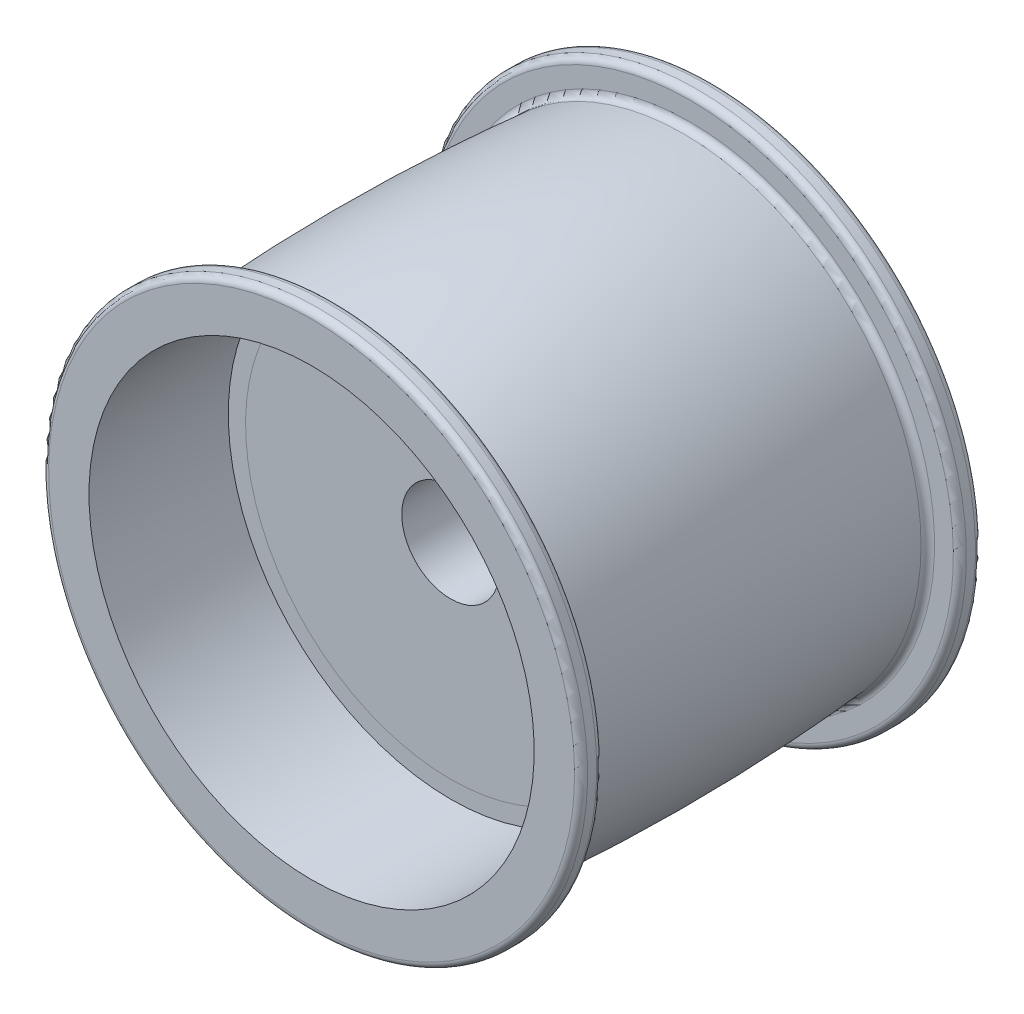
ISO-10303-21;
HEADER;
FILE_DESCRIPTION(('STEP AP214'),'2;1');
FILE_NAME('part.step','',(''),(''),'','','');
FILE_SCHEMA(('AUTOMOTIVE_DESIGN { 1 0 10303 214 1 1 1 1 }'));
ENDSEC;
DATA;
#1=APPLICATION_CONTEXT('core data for automotive mechanical design processes');
#2=APPLICATION_PROTOCOL_DEFINITION('international standard','automotive_design',2000,#1);
#3=PRODUCT_CONTEXT('',#1,'mechanical');
#4=PRODUCT('Part','Part','',(#3));
#5=PRODUCT_RELATED_PRODUCT_CATEGORY('part','',(#4));
#6=PRODUCT_DEFINITION_FORMATION('','',#4);
#7=PRODUCT_DEFINITION_CONTEXT('part definition',#1,'design');
#8=PRODUCT_DEFINITION('design','',#6,#7);
#9=PRODUCT_DEFINITION_SHAPE('','',#8);
#10=(LENGTH_UNIT() NAMED_UNIT(*) SI_UNIT(.MILLI.,.METRE.));
#11=(NAMED_UNIT(*) PLANE_ANGLE_UNIT() SI_UNIT($,.RADIAN.));
#12=(NAMED_UNIT(*) SI_UNIT($,.STERADIAN.) SOLID_ANGLE_UNIT());
#13=UNCERTAINTY_MEASURE_WITH_UNIT(LENGTH_MEASURE(1.E-05),#10,'distance_accuracy_value','');
#14=(GEOMETRIC_REPRESENTATION_CONTEXT(3) GLOBAL_UNCERTAINTY_ASSIGNED_CONTEXT((#13)) GLOBAL_UNIT_ASSIGNED_CONTEXT((#10,
#11,#12)) REPRESENTATION_CONTEXT('',''));
#15=CARTESIAN_POINT('',(0.,0.,0.));
#16=DIRECTION('',(0.,0.,1.));
#17=DIRECTION('',(1.,0.,0.));
#18=AXIS2_PLACEMENT_3D('',#15,#16,#17);
#19=CARTESIAN_POINT('',(0.,20.,0.0309999999999815));
#20=DIRECTION('',(0.,0.,-1.));
#21=DIRECTION('',(0.,1.,0.));
#22=AXIS2_PLACEMENT_3D('',#19,#20,#21);
#23=PLANE('',#22);
#24=CARTESIAN_POINT('',(0.,0.,0.0309999999999872));
#25=DIRECTION('',(0.,0.,1.));
#26=DIRECTION('',(0.,-1.,0.));
#27=AXIS2_PLACEMENT_3D('',#24,#25,#26);
#28=CIRCLE('',#27,4.76249999999999);
#29=CARTESIAN_POINT('',(0.,-4.76249999999998,0.0309999999999894));
#30=VERTEX_POINT('',#29);
#31=EDGE_CURVE('E11',#30,#30,#28,.T.);
#32=ORIENTED_EDGE('',*,*,#31,.F.);
#33=EDGE_LOOP('',(#32));
#34=FACE_BOUND('',#33,.T.);
#35=CARTESIAN_POINT('',(0.,0.,0.0309999999999942));
#36=DIRECTION('',(0.,0.,1.));
#37=DIRECTION('',(0.,-1.,0.));
#38=AXIS2_PLACEMENT_3D('',#35,#36,#37);
#39=CIRCLE('',#38,20.);
#40=CARTESIAN_POINT('',(0.,-20.,0.0310000000000034));
#41=VERTEX_POINT('',#40);
#42=EDGE_CURVE('E54',#41,#41,#39,.T.);
#43=ORIENTED_EDGE('',*,*,#42,.T.);
#44=EDGE_LOOP('',(#43));
#45=FACE_BOUND('',#44,.T.);
#46=ADVANCED_FACE('F40',(#34,#45),#23,.F.);
#47=CARTESIAN_POINT('',(0.,0.,0.));
#48=DIRECTION('',(0.,0.,1.));
#49=DIRECTION('',(0.,-1.,0.));
#50=AXIS2_PLACEMENT_3D('',#47,#48,#49);
#51=CYLINDRICAL_SURFACE('',#50,4.76249999999999);
#52=CARTESIAN_POINT('',(0.,0.,-11.969));
#53=DIRECTION('',(0.,0.,1.));
#54=DIRECTION('',(0.,-1.,0.));
#55=AXIS2_PLACEMENT_3D('',#52,#53,#54);
#56=CIRCLE('',#55,4.7625);
#57=CARTESIAN_POINT('',(0.,-4.7625,-11.969));
#58=VERTEX_POINT('',#57);
#59=EDGE_CURVE('E46',#58,#58,#56,.T.);
#60=ORIENTED_EDGE('',*,*,#59,.F.);
#61=EDGE_LOOP('',(#60));
#62=FACE_BOUND('',#61,.T.);
#63=ORIENTED_EDGE('',*,*,#31,.T.);
#64=EDGE_LOOP('',(#63));
#65=FACE_BOUND('',#64,.T.);
#66=ADVANCED_FACE('F69',(#62,#65),#51,.F.);
#67=CARTESIAN_POINT('',(0.,20.,-11.969));
#68=DIRECTION('',(0.,0.,1.));
#69=DIRECTION('',(0.,-1.,0.));
#70=AXIS2_PLACEMENT_3D('',#67,#68,#69);
#71=PLANE('',#70);
#72=CARTESIAN_POINT('',(0.,0.,-11.969));
#73=DIRECTION('',(0.,0.,1.));
#74=DIRECTION('',(0.,-1.,0.));
#75=AXIS2_PLACEMENT_3D('',#72,#73,#74);
#76=CIRCLE('',#75,20.);
#77=CARTESIAN_POINT('',(0.,-20.,-11.969));
#78=VERTEX_POINT('',#77);
#79=EDGE_CURVE('E50',#78,#78,#76,.T.);
#80=ORIENTED_EDGE('',*,*,#79,.F.);
#81=EDGE_LOOP('',(#80));
#82=FACE_BOUND('',#81,.T.);
#83=ORIENTED_EDGE('',*,*,#59,.T.);
#84=EDGE_LOOP('',(#83));
#85=FACE_BOUND('',#84,.T.);
#86=ADVANCED_FACE('F64',(#82,#85),#71,.F.);
#87=CARTESIAN_POINT('',(0.,0.,0.));
#88=DIRECTION('',(0.,0.,1.));
#89=DIRECTION('',(0.,-1.,0.));
#90=AXIS2_PLACEMENT_3D('',#87,#88,#89);
#91=CYLINDRICAL_SURFACE('',#90,20.);
#92=ORIENTED_EDGE('',*,*,#42,.F.);
#93=EDGE_LOOP('',(#92));
#94=FACE_BOUND('',#93,.T.);
#95=ORIENTED_EDGE('',*,*,#79,.T.);
#96=EDGE_LOOP('',(#95));
#97=FACE_BOUND('',#96,.T.);
#98=ADVANCED_FACE('F61',(#94,#97),#91,.T.);
#99=CLOSED_SHELL('',(#46,#66,#86,#98));
#100=MANIFOLD_SOLID_BREP('B2',#99);
#101=CARTESIAN_POINT('',(0.,21.717,-25.527));
#102=DIRECTION('',(0.,0.,1.));
#103=DIRECTION('',(0.,-1.,0.));
#104=AXIS2_PLACEMENT_3D('',#101,#102,#103);
#105=PLANE('',#104);
#106=CARTESIAN_POINT('',(0.,0.,-25.527));
#107=DIRECTION('',(0.,0.,1.));
#108=DIRECTION('',(0.,-1.,0.));
#109=AXIS2_PLACEMENT_3D('',#106,#107,#108);
#110=CIRCLE('',#109,25.654);
#111=CARTESIAN_POINT('',(0.,-25.654,-25.527));
#112=VERTEX_POINT('',#111);
#113=EDGE_CURVE('E116',#112,#112,#110,.F.);
#114=ORIENTED_EDGE('',*,*,#113,.T.);
#115=EDGE_LOOP('',(#114));
#116=FACE_BOUND('',#115,.T.);
#117=CARTESIAN_POINT('',(0.,0.,-25.527));
#118=DIRECTION('',(0.,0.,1.));
#119=DIRECTION('',(0.,-1.,0.));
#120=AXIS2_PLACEMENT_3D('',#117,#118,#119);
#121=CIRCLE('',#120,21.717);
#122=CARTESIAN_POINT('',(0.,-21.717,-25.527));
#123=VERTEX_POINT('',#122);
#124=EDGE_CURVE('E160',#123,#123,#121,.T.);
#125=ORIENTED_EDGE('',*,*,#124,.T.);
#126=EDGE_LOOP('',(#125));
#127=FACE_BOUND('',#126,.T.);
#128=ADVANCED_FACE('F101',(#116,#127),#105,.F.);
#129=CARTESIAN_POINT('',(0.,0.,0.));
#130=DIRECTION('',(0.,0.,1.));
#131=DIRECTION('',(0.,-1.,0.));
#132=AXIS2_PLACEMENT_3D('',#129,#130,#131);
#133=CYLINDRICAL_SURFACE('',#132,26.289);
#134=CARTESIAN_POINT('',(0.,0.,-24.892));
#135=DIRECTION('',(0.,0.,1.));
#136=DIRECTION('',(0.,-1.,0.));
#137=AXIS2_PLACEMENT_3D('',#134,#135,#136);
#138=CIRCLE('',#137,26.289);
#139=CARTESIAN_POINT('',(0.,-26.289,-24.892));
#140=VERTEX_POINT('',#139);
#141=EDGE_CURVE('E121',#140,#140,#138,.T.);
#142=ORIENTED_EDGE('',*,*,#141,.T.);
#143=EDGE_LOOP('',(#142));
#144=FACE_BOUND('',#143,.T.);
#145=CARTESIAN_POINT('',(0.,0.,-24.003));
#146=DIRECTION('',(0.,0.,-1.));
#147=DIRECTION('',(0.,1.,0.));
#148=AXIS2_PLACEMENT_3D('',#145,#146,#147);
#149=CIRCLE('',#148,26.289);
#150=CARTESIAN_POINT('',(0.,26.289,-24.003));
#151=VERTEX_POINT('',#150);
#152=EDGE_CURVE('E124',#151,#151,#149,.T.);
#153=ORIENTED_EDGE('',*,*,#152,.T.);
#154=EDGE_LOOP('',(#153));
#155=FACE_BOUND('',#154,.T.);
#156=ADVANCED_FACE('F206',(#144,#155),#133,.T.);
#157=CARTESIAN_POINT('',(0.,26.289,-23.368));
#158=DIRECTION('',(0.,0.,-1.));
#159=DIRECTION('',(0.,1.,0.));
#160=AXIS2_PLACEMENT_3D('',#157,#158,#159);
#161=PLANE('',#160);
#162=CARTESIAN_POINT('',(0.,0.,-23.368));
#163=DIRECTION('',(0.,0.,-1.));
#164=DIRECTION('',(0.,1.,0.));
#165=AXIS2_PLACEMENT_3D('',#162,#163,#164);
#166=CIRCLE('',#165,23.8204695998392);
#167=CARTESIAN_POINT('',(0.,23.8204695998392,-23.368));
#168=VERTEX_POINT('',#167);
#169=EDGE_CURVE('E133',#168,#168,#166,.T.);
#170=ORIENTED_EDGE('',*,*,#169,.T.);
#171=EDGE_LOOP('',(#170));
#172=FACE_BOUND('',#171,.T.);
#173=CARTESIAN_POINT('',(0.,0.,-23.368));
#174=DIRECTION('',(0.,0.,-1.));
#175=DIRECTION('',(0.,1.,0.));
#176=AXIS2_PLACEMENT_3D('',#173,#174,#175);
#177=CIRCLE('',#176,25.654);
#178=CARTESIAN_POINT('',(0.,25.654,-23.368));
#179=VERTEX_POINT('',#178);
#180=EDGE_CURVE('E136',#179,#179,#177,.F.);
#181=ORIENTED_EDGE('',*,*,#180,.T.);
#182=EDGE_LOOP('',(#181));
#183=FACE_BOUND('',#182,.T.);
#184=ADVANCED_FACE('F212',(#172,#183),#161,.F.);
#185=CARTESIAN_POINT('',(0.,0.,-5.96899999999998));
#186=DIRECTION('',(0.,0.,1.));
#187=DIRECTION('',(0.,-1.,0.));
#188=AXIS2_PLACEMENT_3D('',#185,#186,#187);
#189=DEGENERATE_TOROIDAL_SURFACE('',#188,179.324,203.2,.F.);
#190=CARTESIAN_POINT('',(0.,0.,-22.6807757009346));
#191=DIRECTION('',(0.,0.,1.));
#192=DIRECTION('',(0.,-1.,0.));
#193=AXIS2_PLACEMENT_3D('',#190,#191,#192);
#194=CIRCLE('',#193,23.1876207848865);
#195=CARTESIAN_POINT('',(0.,-23.1876207848865,-22.6807757009346));
#196=VERTEX_POINT('',#195);
#197=EDGE_CURVE('E139',#196,#196,#194,.T.);
#198=ORIENTED_EDGE('',*,*,#197,.T.);
#199=EDGE_LOOP('',(#198));
#200=FACE_BOUND('',#199,.T.);
#201=CARTESIAN_POINT('',(0.,0.,10.7427757009346));
#202=DIRECTION('',(0.,0.,-1.));
#203=DIRECTION('',(0.,1.,0.));
#204=AXIS2_PLACEMENT_3D('',#201,#202,#203);
#205=CIRCLE('',#204,23.1876207848865);
#206=CARTESIAN_POINT('',(0.,23.1876207848865,10.7427757009346));
#207=VERTEX_POINT('',#206);
#208=EDGE_CURVE('E142',#207,#207,#205,.T.);
#209=ORIENTED_EDGE('',*,*,#208,.T.);
#210=EDGE_LOOP('',(#209));
#211=FACE_BOUND('',#210,.T.);
#212=ADVANCED_FACE('F242',(#200,#211),#189,.F.);
#213=CARTESIAN_POINT('',(0.,26.289,11.43));
#214=DIRECTION('',(0.,0.,1.));
#215=DIRECTION('',(0.,-1.,0.));
#216=AXIS2_PLACEMENT_3D('',#213,#214,#215);
#217=PLANE('',#216);
#218=CARTESIAN_POINT('',(0.,0.,11.43));
#219=DIRECTION('',(0.,0.,1.));
#220=DIRECTION('',(0.,-1.,0.));
#221=AXIS2_PLACEMENT_3D('',#218,#219,#220);
#222=CIRCLE('',#221,23.8204695998392);
#223=CARTESIAN_POINT('',(0.,-23.8204695998392,11.43));
#224=VERTEX_POINT('',#223);
#225=EDGE_CURVE('E127',#224,#224,#222,.T.);
#226=ORIENTED_EDGE('',*,*,#225,.T.);
#227=EDGE_LOOP('',(#226));
#228=FACE_BOUND('',#227,.T.);
#229=CARTESIAN_POINT('',(0.,0.,11.43));
#230=DIRECTION('',(0.,0.,1.));
#231=DIRECTION('',(0.,-1.,0.));
#232=AXIS2_PLACEMENT_3D('',#229,#230,#231);
#233=CIRCLE('',#232,25.654);
#234=CARTESIAN_POINT('',(0.,-25.654,11.43));
#235=VERTEX_POINT('',#234);
#236=EDGE_CURVE('E130',#235,#235,#233,.F.);
#237=ORIENTED_EDGE('',*,*,#236,.T.);
#238=EDGE_LOOP('',(#237));
#239=FACE_BOUND('',#238,.T.);
#240=ADVANCED_FACE('F203',(#228,#239),#217,.F.);
#241=CARTESIAN_POINT('',(0.,0.,0.));
#242=DIRECTION('',(0.,0.,1.));
#243=DIRECTION('',(0.,-1.,0.));
#244=AXIS2_PLACEMENT_3D('',#241,#242,#243);
#245=CYLINDRICAL_SURFACE('',#244,26.289);
#246=CARTESIAN_POINT('',(0.,0.,12.065));
#247=DIRECTION('',(0.,0.,1.));
#248=DIRECTION('',(0.,-1.,0.));
#249=AXIS2_PLACEMENT_3D('',#246,#247,#248);
#250=CIRCLE('',#249,26.289);
#251=CARTESIAN_POINT('',(0.,-26.289,12.065));
#252=VERTEX_POINT('',#251);
#253=EDGE_CURVE('E108',#252,#252,#250,.T.);
#254=ORIENTED_EDGE('',*,*,#253,.T.);
#255=EDGE_LOOP('',(#254));
#256=FACE_BOUND('',#255,.T.);
#257=CARTESIAN_POINT('',(0.,0.,12.954));
#258=DIRECTION('',(0.,0.,-1.));
#259=DIRECTION('',(0.,1.,0.));
#260=AXIS2_PLACEMENT_3D('',#257,#258,#259);
#261=CIRCLE('',#260,26.289);
#262=CARTESIAN_POINT('',(0.,26.289,12.954));
#263=VERTEX_POINT('',#262);
#264=EDGE_CURVE('E112',#263,#263,#261,.T.);
#265=ORIENTED_EDGE('',*,*,#264,.T.);
#266=EDGE_LOOP('',(#265));
#267=FACE_BOUND('',#266,.T.);
#268=ADVANCED_FACE('F198',(#256,#267),#245,.T.);
#269=CARTESIAN_POINT('',(0.,21.717,13.589));
#270=DIRECTION('',(0.,0.,-1.));
#271=DIRECTION('',(0.,1.,0.));
#272=AXIS2_PLACEMENT_3D('',#269,#270,#271);
#273=PLANE('',#272);
#274=CARTESIAN_POINT('',(0.,0.,13.589));
#275=DIRECTION('',(0.,0.,-1.));
#276=DIRECTION('',(0.,1.,0.));
#277=AXIS2_PLACEMENT_3D('',#274,#275,#276);
#278=CIRCLE('',#277,25.654);
#279=CARTESIAN_POINT('',(0.,25.654,13.589));
#280=VERTEX_POINT('',#279);
#281=EDGE_CURVE('E39',#280,#280,#278,.F.);
#282=ORIENTED_EDGE('',*,*,#281,.T.);
#283=EDGE_LOOP('',(#282));
#284=FACE_BOUND('',#283,.T.);
#285=CARTESIAN_POINT('',(0.,0.,13.589));
#286=DIRECTION('',(0.,0.,1.));
#287=DIRECTION('',(0.,-1.,0.));
#288=AXIS2_PLACEMENT_3D('',#285,#286,#287);
#289=CIRCLE('',#288,21.717);
#290=CARTESIAN_POINT('',(0.,-21.717,13.589));
#291=VERTEX_POINT('',#290);
#292=EDGE_CURVE('E145',#291,#291,#289,.T.);
#293=ORIENTED_EDGE('',*,*,#292,.F.);
#294=EDGE_LOOP('',(#293));
#295=FACE_BOUND('',#294,.T.);
#296=ADVANCED_FACE('F193',(#284,#295),#273,.F.);
#297=CARTESIAN_POINT('',(0.,0.,0.));
#298=DIRECTION('',(0.,0.,1.));
#299=DIRECTION('',(0.,-1.,0.));
#300=AXIS2_PLACEMENT_3D('',#297,#298,#299);
#301=CYLINDRICAL_SURFACE('',#300,21.717);
#302=CARTESIAN_POINT('',(0.,0.,0.));
#303=DIRECTION('',(0.,0.,1.));
#304=DIRECTION('',(0.,-1.,0.));
#305=AXIS2_PLACEMENT_3D('',#302,#303,#304);
#306=CIRCLE('',#305,21.717);
#307=CARTESIAN_POINT('',(0.,-21.717,0.));
#308=VERTEX_POINT('',#307);
#309=EDGE_CURVE('E148',#308,#308,#306,.T.);
#310=ORIENTED_EDGE('',*,*,#309,.F.);
#311=EDGE_LOOP('',(#310));
#312=FACE_BOUND('',#311,.T.);
#313=ORIENTED_EDGE('',*,*,#292,.T.);
#314=EDGE_LOOP('',(#313));
#315=FACE_BOUND('',#314,.T.);
#316=ADVANCED_FACE('F187',(#312,#315),#301,.F.);
#317=CARTESIAN_POINT('',(0.,20.,0.));
#318=DIRECTION('',(0.,0.,-1.));
#319=DIRECTION('',(0.,1.,0.));
#320=AXIS2_PLACEMENT_3D('',#317,#318,#319);
#321=PLANE('',#320);
#322=CARTESIAN_POINT('',(0.,0.,0.));
#323=DIRECTION('',(0.,0.,1.));
#324=DIRECTION('',(0.,-1.,0.));
#325=AXIS2_PLACEMENT_3D('',#322,#323,#324);
#326=CIRCLE('',#325,20.);
#327=CARTESIAN_POINT('',(0.,-20.,0.));
#328=VERTEX_POINT('',#327);
#329=EDGE_CURVE('E151',#328,#328,#326,.T.);
#330=ORIENTED_EDGE('',*,*,#329,.F.);
#331=EDGE_LOOP('',(#330));
#332=FACE_BOUND('',#331,.T.);
#333=ORIENTED_EDGE('',*,*,#309,.T.);
#334=EDGE_LOOP('',(#333));
#335=FACE_BOUND('',#334,.T.);
#336=ADVANCED_FACE('F181',(#332,#335),#321,.F.);
#337=CARTESIAN_POINT('',(0.,0.,0.));
#338=DIRECTION('',(0.,0.,1.));
#339=DIRECTION('',(0.,-1.,0.));
#340=AXIS2_PLACEMENT_3D('',#337,#338,#339);
#341=CYLINDRICAL_SURFACE('',#340,20.);
#342=CARTESIAN_POINT('',(0.,0.,-11.938));
#343=DIRECTION('',(0.,0.,1.));
#344=DIRECTION('',(0.,-1.,0.));
#345=AXIS2_PLACEMENT_3D('',#342,#343,#344);
#346=CIRCLE('',#345,20.);
#347=CARTESIAN_POINT('',(0.,-20.,-11.938));
#348=VERTEX_POINT('',#347);
#349=EDGE_CURVE('E154',#348,#348,#346,.T.);
#350=ORIENTED_EDGE('',*,*,#349,.F.);
#351=EDGE_LOOP('',(#350));
#352=FACE_BOUND('',#351,.T.);
#353=ORIENTED_EDGE('',*,*,#329,.T.);
#354=EDGE_LOOP('',(#353));
#355=FACE_BOUND('',#354,.T.);
#356=ADVANCED_FACE('F175',(#352,#355),#341,.F.);
#357=CARTESIAN_POINT('',(0.,20.,-11.938));
#358=DIRECTION('',(0.,0.,1.));
#359=DIRECTION('',(0.,-1.,0.));
#360=AXIS2_PLACEMENT_3D('',#357,#358,#359);
#361=PLANE('',#360);
#362=CARTESIAN_POINT('',(0.,0.,-11.938));
#363=DIRECTION('',(0.,0.,1.));
#364=DIRECTION('',(0.,-1.,0.));
#365=AXIS2_PLACEMENT_3D('',#362,#363,#364);
#366=CIRCLE('',#365,21.717);
#367=CARTESIAN_POINT('',(0.,-21.717,-11.938));
#368=VERTEX_POINT('',#367);
#369=EDGE_CURVE('E157',#368,#368,#366,.T.);
#370=ORIENTED_EDGE('',*,*,#369,.F.);
#371=EDGE_LOOP('',(#370));
#372=FACE_BOUND('',#371,.T.);
#373=ORIENTED_EDGE('',*,*,#349,.T.);
#374=EDGE_LOOP('',(#373));
#375=FACE_BOUND('',#374,.T.);
#376=ADVANCED_FACE('F169',(#372,#375),#361,.F.);
#377=CARTESIAN_POINT('',(0.,0.,0.));
#378=DIRECTION('',(0.,0.,1.));
#379=DIRECTION('',(0.,-1.,0.));
#380=AXIS2_PLACEMENT_3D('',#377,#378,#379);
#381=CYLINDRICAL_SURFACE('',#380,21.717);
#382=ORIENTED_EDGE('',*,*,#124,.F.);
#383=EDGE_LOOP('',(#382));
#384=FACE_BOUND('',#383,.T.);
#385=ORIENTED_EDGE('',*,*,#369,.T.);
#386=EDGE_LOOP('',(#385));
#387=FACE_BOUND('',#386,.T.);
#388=ADVANCED_FACE('F165',(#384,#387),#381,.F.);
#389=CARTESIAN_POINT('',(0.,0.,-22.733));
#390=DIRECTION('',(0.,0.,-1.));
#391=DIRECTION('',(0.,1.,0.));
#392=AXIS2_PLACEMENT_3D('',#389,#390,#391);
#393=TOROIDAL_SURFACE('',#392,23.8204695998392,0.635);
#394=ORIENTED_EDGE('',*,*,#169,.F.);
#395=EDGE_LOOP('',(#394));
#396=FACE_BOUND('',#395,.T.);
#397=ORIENTED_EDGE('',*,*,#197,.F.);
#398=EDGE_LOOP('',(#397));
#399=FACE_BOUND('',#398,.T.);
#400=ADVANCED_FACE('F168',(#396,#399),#393,.F.);
#401=CARTESIAN_POINT('',(0.,0.,10.795));
#402=DIRECTION('',(0.,0.,1.));
#403=DIRECTION('',(0.,-1.,0.));
#404=AXIS2_PLACEMENT_3D('',#401,#402,#403);
#405=TOROIDAL_SURFACE('',#404,23.8204695998392,0.635);
#406=ORIENTED_EDGE('',*,*,#208,.F.);
#407=EDGE_LOOP('',(#406));
#408=FACE_BOUND('',#407,.T.);
#409=ORIENTED_EDGE('',*,*,#225,.F.);
#410=EDGE_LOOP('',(#409));
#411=FACE_BOUND('',#410,.T.);
#412=ADVANCED_FACE('F219',(#408,#411),#405,.F.);
#413=CARTESIAN_POINT('',(0.,0.,-24.892));
#414=DIRECTION('',(0.,0.,1.));
#415=DIRECTION('',(0.,-1.,0.));
#416=AXIS2_PLACEMENT_3D('',#413,#414,#415);
#417=TOROIDAL_SURFACE('',#416,25.654,0.635);
#418=ORIENTED_EDGE('',*,*,#113,.F.);
#419=EDGE_LOOP('',(#418));
#420=FACE_BOUND('',#419,.T.);
#421=ORIENTED_EDGE('',*,*,#141,.F.);
#422=EDGE_LOOP('',(#421));
#423=FACE_BOUND('',#422,.T.);
#424=ADVANCED_FACE('F223',(#420,#423),#417,.T.);
#425=CARTESIAN_POINT('',(0.,0.,-24.003));
#426=DIRECTION('',(0.,0.,-1.));
#427=DIRECTION('',(0.,1.,0.));
#428=AXIS2_PLACEMENT_3D('',#425,#426,#427);
#429=TOROIDAL_SURFACE('',#428,25.654,0.635);
#430=ORIENTED_EDGE('',*,*,#152,.F.);
#431=EDGE_LOOP('',(#430));
#432=FACE_BOUND('',#431,.T.);
#433=ORIENTED_EDGE('',*,*,#180,.F.);
#434=EDGE_LOOP('',(#433));
#435=FACE_BOUND('',#434,.T.);
#436=ADVANCED_FACE('F227',(#432,#435),#429,.T.);
#437=CARTESIAN_POINT('',(0.,0.,12.065));
#438=DIRECTION('',(0.,0.,1.));
#439=DIRECTION('',(0.,-1.,0.));
#440=AXIS2_PLACEMENT_3D('',#437,#438,#439);
#441=TOROIDAL_SURFACE('',#440,25.654,0.635);
#442=ORIENTED_EDGE('',*,*,#236,.F.);
#443=EDGE_LOOP('',(#442));
#444=FACE_BOUND('',#443,.T.);
#445=ORIENTED_EDGE('',*,*,#253,.F.);
#446=EDGE_LOOP('',(#445));
#447=FACE_BOUND('',#446,.T.);
#448=ADVANCED_FACE('F230',(#444,#447),#441,.T.);
#449=CARTESIAN_POINT('',(0.,0.,12.954));
#450=DIRECTION('',(0.,0.,-1.));
#451=DIRECTION('',(0.,1.,0.));
#452=AXIS2_PLACEMENT_3D('',#449,#450,#451);
#453=TOROIDAL_SURFACE('',#452,25.654,0.635);
#454=ORIENTED_EDGE('',*,*,#264,.F.);
#455=EDGE_LOOP('',(#454));
#456=FACE_BOUND('',#455,.T.);
#457=ORIENTED_EDGE('',*,*,#281,.F.);
#458=EDGE_LOOP('',(#457));
#459=FACE_BOUND('',#458,.T.);
#460=ADVANCED_FACE('F103',(#456,#459),#453,.T.);
#461=CLOSED_SHELL('',(#128,#156,#184,#212,#240,#268,#296,#316,#336,#356,#376,#388,#400,#412,
#424,#436,#448,#460));
#462=MANIFOLD_SOLID_BREP('B6',#461);
#463=ADVANCED_BREP_SHAPE_REPRESENTATION('',(#18,#100,#462),#14);
#464=SHAPE_DEFINITION_REPRESENTATION(#9,#463);
ENDSEC;
END-ISO-10303-21;
